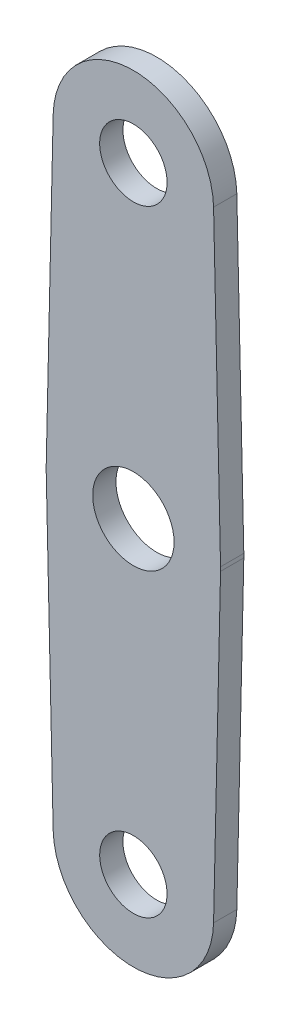
ISO-10303-21;
HEADER;
FILE_DESCRIPTION(('STEP AP214'),'2;1');
FILE_NAME('part.step','',(''),(''),'','','');
FILE_SCHEMA(('AUTOMOTIVE_DESIGN { 1 0 10303 214 1 1 1 1 }'));
ENDSEC;
DATA;
#1=APPLICATION_CONTEXT('core data for automotive mechanical design processes');
#2=APPLICATION_PROTOCOL_DEFINITION('international standard','automotive_design',2000,#1);
#3=PRODUCT_CONTEXT('',#1,'mechanical');
#4=PRODUCT('Part','Part','',(#3));
#5=PRODUCT_RELATED_PRODUCT_CATEGORY('part','',(#4));
#6=PRODUCT_DEFINITION_FORMATION('','',#4);
#7=PRODUCT_DEFINITION_CONTEXT('part definition',#1,'design');
#8=PRODUCT_DEFINITION('design','',#6,#7);
#9=PRODUCT_DEFINITION_SHAPE('','',#8);
#10=(LENGTH_UNIT() NAMED_UNIT(*) SI_UNIT(.MILLI.,.METRE.));
#11=(NAMED_UNIT(*) PLANE_ANGLE_UNIT() SI_UNIT($,.RADIAN.));
#12=(NAMED_UNIT(*) SI_UNIT($,.STERADIAN.) SOLID_ANGLE_UNIT());
#13=UNCERTAINTY_MEASURE_WITH_UNIT(LENGTH_MEASURE(1.E-05),#10,'distance_accuracy_value','');
#14=(GEOMETRIC_REPRESENTATION_CONTEXT(3) GLOBAL_UNCERTAINTY_ASSIGNED_CONTEXT((#13)) GLOBAL_UNIT_ASSIGNED_CONTEXT((#10,
#11,#12)) REPRESENTATION_CONTEXT('',''));
#15=CARTESIAN_POINT('',(0.,0.,0.));
#16=DIRECTION('',(0.,0.,1.));
#17=DIRECTION('',(1.,0.,0.));
#18=AXIS2_PLACEMENT_3D('',#15,#16,#17);
#19=CARTESIAN_POINT('',(0.,13.25,0.5));
#20=DIRECTION('',(0.,0.,1.));
#21=DIRECTION('',(1.,0.,0.));
#22=AXIS2_PLACEMENT_3D('',#19,#20,#21);
#23=PLANE('',#22);
#24=CARTESIAN_POINT('',(0.,13.25,0.5));
#25=DIRECTION('',(0.,0.,1.));
#26=DIRECTION('',(1.,0.,0.));
#27=AXIS2_PLACEMENT_3D('',#24,#25,#26);
#28=CIRCLE('',#27,1.45);
#29=CARTESIAN_POINT('',(1.45,13.25,0.5));
#30=VERTEX_POINT('',#29);
#31=EDGE_CURVE('E228',#30,#30,#28,.T.);
#32=ORIENTED_EDGE('',*,*,#31,.F.);
#33=EDGE_LOOP('',(#32));
#34=FACE_BOUND('',#33,.T.);
#35=CARTESIAN_POINT('',(0.,13.25,0.5));
#36=DIRECTION('',(0.,0.,1.));
#37=DIRECTION('',(1.,0.,0.));
#38=AXIS2_PLACEMENT_3D('',#35,#36,#37);
#39=CIRCLE('',#38,3.45);
#40=CARTESIAN_POINT('',(3.44911558617665,13.3281132075472,0.5));
#41=VERTEX_POINT('',#40);
#42=CARTESIAN_POINT('',(-3.44911558617665,13.3281132075472,0.5));
#43=VERTEX_POINT('',#42);
#44=EDGE_CURVE('E178',#41,#43,#39,.T.);
#45=ORIENTED_EDGE('',*,*,#44,.T.);
#46=DIRECTION('',(-0.0226415094339621,-0.999743648167145,0.));
#47=VECTOR('',#46,1.);
#48=CARTESIAN_POINT('',(-3.44911558617665,13.3281132075472,0.5));
#49=LINE('',#48,#47);
#50=CARTESIAN_POINT('',(-3.74903868062679,0.0849056603773579,0.5));
#51=VERTEX_POINT('',#50);
#52=EDGE_CURVE('E112',#43,#51,#49,.T.);
#53=ORIENTED_EDGE('',*,*,#52,.T.);
#54=CARTESIAN_POINT('',(0.,0.,0.5));
#55=DIRECTION('',(0.,0.,1.));
#56=DIRECTION('',(1.,0.,0.));
#57=AXIS2_PLACEMENT_3D('',#54,#55,#56);
#58=CIRCLE('',#57,3.75);
#59=CARTESIAN_POINT('',(-3.74903868062679,-0.0849056603773576,0.5));
#60=VERTEX_POINT('',#59);
#61=EDGE_CURVE('E199',#51,#60,#58,.T.);
#62=ORIENTED_EDGE('',*,*,#61,.T.);
#63=DIRECTION('',(0.0226415094339621,-0.999743648167145,0.));
#64=VECTOR('',#63,1.);
#65=CARTESIAN_POINT('',(-3.44911558617665,-13.3281132075472,0.5));
#66=LINE('',#65,#64);
#67=CARTESIAN_POINT('',(-3.44911558617665,-13.3281132075472,0.5));
#68=VERTEX_POINT('',#67);
#69=EDGE_CURVE('E213',#60,#68,#66,.T.);
#70=ORIENTED_EDGE('',*,*,#69,.T.);
#71=CARTESIAN_POINT('',(0.,-13.25,0.5));
#72=DIRECTION('',(0.,0.,1.));
#73=DIRECTION('',(-1.,0.,0.));
#74=AXIS2_PLACEMENT_3D('',#71,#72,#73);
#75=CIRCLE('',#74,3.45);
#76=CARTESIAN_POINT('',(3.44911558617665,-13.3281132075472,0.5));
#77=VERTEX_POINT('',#76);
#78=EDGE_CURVE('E131',#68,#77,#75,.T.);
#79=ORIENTED_EDGE('',*,*,#78,.T.);
#80=DIRECTION('',(0.0226415094339621,0.999743648167145,0.));
#81=VECTOR('',#80,1.);
#82=CARTESIAN_POINT('',(3.44911558617665,-13.3281132075472,0.5));
#83=LINE('',#82,#81);
#84=CARTESIAN_POINT('',(3.74903868062679,-0.0849056603773579,0.5));
#85=VERTEX_POINT('',#84);
#86=EDGE_CURVE('E125',#77,#85,#83,.T.);
#87=ORIENTED_EDGE('',*,*,#86,.T.);
#88=CARTESIAN_POINT('',(0.,0.,0.5));
#89=DIRECTION('',(0.,0.,1.));
#90=DIRECTION('',(1.,0.,0.));
#91=AXIS2_PLACEMENT_3D('',#88,#89,#90);
#92=CIRCLE('',#91,3.75);
#93=CARTESIAN_POINT('',(3.74903868062679,0.084905660377358,0.5));
#94=VERTEX_POINT('',#93);
#95=EDGE_CURVE('E129',#85,#94,#92,.T.);
#96=ORIENTED_EDGE('',*,*,#95,.T.);
#97=DIRECTION('',(-0.0226415094339621,0.999743648167145,0.));
#98=VECTOR('',#97,1.);
#99=CARTESIAN_POINT('',(3.44911558617665,13.3281132075472,0.5));
#100=LINE('',#99,#98);
#101=EDGE_CURVE('E69',#94,#41,#100,.T.);
#102=ORIENTED_EDGE('',*,*,#101,.T.);
#103=EDGE_LOOP('',(#45,#53,#62,#70,#79,#87,#96,#102));
#104=FACE_BOUND('',#103,.T.);
#105=CARTESIAN_POINT('',(0.,0.,0.5));
#106=DIRECTION('',(0.,0.,1.));
#107=DIRECTION('',(1.,0.,0.));
#108=AXIS2_PLACEMENT_3D('',#105,#106,#107);
#109=CIRCLE('',#108,1.75);
#110=CARTESIAN_POINT('',(1.75,0.,0.5));
#111=VERTEX_POINT('',#110);
#112=EDGE_CURVE('E160',#111,#111,#109,.T.);
#113=ORIENTED_EDGE('',*,*,#112,.F.);
#114=EDGE_LOOP('',(#113));
#115=FACE_BOUND('',#114,.T.);
#116=CARTESIAN_POINT('',(0.,-13.25,0.5));
#117=DIRECTION('',(0.,0.,1.));
#118=DIRECTION('',(-1.,0.,0.));
#119=AXIS2_PLACEMENT_3D('',#116,#117,#118);
#120=CIRCLE('',#119,1.45);
#121=CARTESIAN_POINT('',(-1.45,-13.25,0.5));
#122=VERTEX_POINT('',#121);
#123=EDGE_CURVE('E236',#122,#122,#120,.T.);
#124=ORIENTED_EDGE('',*,*,#123,.F.);
#125=EDGE_LOOP('',(#124));
#126=FACE_BOUND('',#125,.T.);
#127=ADVANCED_FACE('F51',(#34,#104,#115,#126),#23,.T.);
#128=CARTESIAN_POINT('',(0.,13.25,-0.5));
#129=DIRECTION('',(0.,0.,1.));
#130=DIRECTION('',(1.,0.,0.));
#131=AXIS2_PLACEMENT_3D('',#128,#129,#130);
#132=PLANE('',#131);
#133=CARTESIAN_POINT('',(0.,13.25,-0.5));
#134=DIRECTION('',(0.,0.,1.));
#135=DIRECTION('',(1.,0.,0.));
#136=AXIS2_PLACEMENT_3D('',#133,#134,#135);
#137=CIRCLE('',#136,3.45);
#138=CARTESIAN_POINT('',(3.44911558617665,13.3281132075472,-0.5));
#139=VERTEX_POINT('',#138);
#140=CARTESIAN_POINT('',(-3.44911558617665,13.3281132075472,-0.5));
#141=VERTEX_POINT('',#140);
#142=EDGE_CURVE('E155',#139,#141,#137,.T.);
#143=ORIENTED_EDGE('',*,*,#142,.F.);
#144=DIRECTION('',(-0.0226415094339621,0.999743648167145,0.));
#145=VECTOR('',#144,1.);
#146=CARTESIAN_POINT('',(3.44911558617665,13.3281132075472,-0.5));
#147=LINE('',#146,#145);
#148=CARTESIAN_POINT('',(3.74903868062679,0.084905660377358,-0.5));
#149=VERTEX_POINT('',#148);
#150=EDGE_CURVE('E104',#149,#139,#147,.T.);
#151=ORIENTED_EDGE('',*,*,#150,.F.);
#152=CARTESIAN_POINT('',(0.,0.,-0.5));
#153=DIRECTION('',(0.,0.,1.));
#154=DIRECTION('',(1.,0.,0.));
#155=AXIS2_PLACEMENT_3D('',#152,#153,#154);
#156=CIRCLE('',#155,3.75);
#157=CARTESIAN_POINT('',(3.74903868062679,-0.0849056603773579,-0.5));
#158=VERTEX_POINT('',#157);
#159=EDGE_CURVE('E98',#158,#149,#156,.T.);
#160=ORIENTED_EDGE('',*,*,#159,.F.);
#161=DIRECTION('',(0.0226415094339621,0.999743648167145,0.));
#162=VECTOR('',#161,1.);
#163=CARTESIAN_POINT('',(3.44911558617665,-13.3281132075472,-0.5));
#164=LINE('',#163,#162);
#165=CARTESIAN_POINT('',(3.44911558617665,-13.3281132075472,-0.5));
#166=VERTEX_POINT('',#165);
#167=EDGE_CURVE('E140',#166,#158,#164,.T.);
#168=ORIENTED_EDGE('',*,*,#167,.F.);
#169=CARTESIAN_POINT('',(0.,-13.25,-0.5));
#170=DIRECTION('',(0.,0.,1.));
#171=DIRECTION('',(-1.,0.,0.));
#172=AXIS2_PLACEMENT_3D('',#169,#170,#171);
#173=CIRCLE('',#172,3.45);
#174=CARTESIAN_POINT('',(-3.44911558617665,-13.3281132075472,-0.5));
#175=VERTEX_POINT('',#174);
#176=EDGE_CURVE('E169',#175,#166,#173,.T.);
#177=ORIENTED_EDGE('',*,*,#176,.F.);
#178=DIRECTION('',(0.0226415094339621,-0.999743648167145,0.));
#179=VECTOR('',#178,1.);
#180=CARTESIAN_POINT('',(-3.44911558617665,-13.3281132075472,-0.5));
#181=LINE('',#180,#179);
#182=CARTESIAN_POINT('',(-3.74903868062679,-0.0849056603773576,-0.5));
#183=VERTEX_POINT('',#182);
#184=EDGE_CURVE('E166',#183,#175,#181,.T.);
#185=ORIENTED_EDGE('',*,*,#184,.F.);
#186=CARTESIAN_POINT('',(0.,0.,-0.5));
#187=DIRECTION('',(0.,0.,1.));
#188=DIRECTION('',(1.,0.,0.));
#189=AXIS2_PLACEMENT_3D('',#186,#187,#188);
#190=CIRCLE('',#189,3.75);
#191=CARTESIAN_POINT('',(-3.74903868062679,0.0849056603773579,-0.5));
#192=VERTEX_POINT('',#191);
#193=EDGE_CURVE('E163',#192,#183,#190,.T.);
#194=ORIENTED_EDGE('',*,*,#193,.F.);
#195=DIRECTION('',(-0.0226415094339621,-0.999743648167145,0.));
#196=VECTOR('',#195,1.);
#197=CARTESIAN_POINT('',(-3.44911558617665,13.3281132075472,-0.5));
#198=LINE('',#197,#196);
#199=EDGE_CURVE('E159',#141,#192,#198,.T.);
#200=ORIENTED_EDGE('',*,*,#199,.F.);
#201=EDGE_LOOP('',(#143,#151,#160,#168,#177,#185,#194,#200));
#202=FACE_BOUND('',#201,.T.);
#203=CARTESIAN_POINT('',(0.,0.,-0.5));
#204=DIRECTION('',(0.,0.,1.));
#205=DIRECTION('',(1.,0.,0.));
#206=AXIS2_PLACEMENT_3D('',#203,#204,#205);
#207=CIRCLE('',#206,1.75);
#208=CARTESIAN_POINT('',(1.75,0.,-0.5));
#209=VERTEX_POINT('',#208);
#210=EDGE_CURVE('E224',#209,#209,#207,.T.);
#211=ORIENTED_EDGE('',*,*,#210,.T.);
#212=EDGE_LOOP('',(#211));
#213=FACE_BOUND('',#212,.T.);
#214=CARTESIAN_POINT('',(0.,13.25,-0.5));
#215=DIRECTION('',(0.,0.,1.));
#216=DIRECTION('',(1.,0.,0.));
#217=AXIS2_PLACEMENT_3D('',#214,#215,#216);
#218=CIRCLE('',#217,1.45);
#219=CARTESIAN_POINT('',(1.45,13.25,-0.5));
#220=VERTEX_POINT('',#219);
#221=EDGE_CURVE('E232',#220,#220,#218,.T.);
#222=ORIENTED_EDGE('',*,*,#221,.T.);
#223=EDGE_LOOP('',(#222));
#224=FACE_BOUND('',#223,.T.);
#225=CARTESIAN_POINT('',(0.,-13.25,-0.5));
#226=DIRECTION('',(0.,0.,1.));
#227=DIRECTION('',(-1.,0.,0.));
#228=AXIS2_PLACEMENT_3D('',#225,#226,#227);
#229=CIRCLE('',#228,1.45);
#230=CARTESIAN_POINT('',(-1.45,-13.25,-0.5));
#231=VERTEX_POINT('',#230);
#232=EDGE_CURVE('E240',#231,#231,#229,.T.);
#233=ORIENTED_EDGE('',*,*,#232,.T.);
#234=EDGE_LOOP('',(#233));
#235=FACE_BOUND('',#234,.T.);
#236=ADVANCED_FACE('F203',(#202,#213,#224,#235),#132,.F.);
#237=CARTESIAN_POINT('',(0.,13.25,0.5));
#238=DIRECTION('',(0.,0.,-1.));
#239=DIRECTION('',(-1.,0.,0.));
#240=AXIS2_PLACEMENT_3D('',#237,#238,#239);
#241=CYLINDRICAL_SURFACE('',#240,3.45);
#242=ORIENTED_EDGE('',*,*,#142,.T.);
#243=DIRECTION('',(0.,0.,-1.));
#244=VECTOR('',#243,1.);
#245=CARTESIAN_POINT('',(-3.44911558617665,13.3281132075472,0.5));
#246=LINE('',#245,#244);
#247=EDGE_CURVE('E11',#43,#141,#246,.T.);
#248=ORIENTED_EDGE('',*,*,#247,.F.);
#249=ORIENTED_EDGE('',*,*,#44,.F.);
#250=DIRECTION('',(0.,0.,-1.));
#251=VECTOR('',#250,1.);
#252=CARTESIAN_POINT('',(3.44911558617665,13.3281132075472,0.5));
#253=LINE('',#252,#251);
#254=EDGE_CURVE('E151',#41,#139,#253,.T.);
#255=ORIENTED_EDGE('',*,*,#254,.T.);
#256=EDGE_LOOP('',(#242,#248,#249,#255));
#257=FACE_BOUND('',#256,.T.);
#258=ADVANCED_FACE('F53',(#257),#241,.T.);
#259=CARTESIAN_POINT('',(-3.44911558617665,13.3281132075472,0.5));
#260=DIRECTION('',(0.999743648167145,-0.0226415094339621,0.));
#261=DIRECTION('',(0.0226415094339621,0.999743648167145,0.));
#262=AXIS2_PLACEMENT_3D('',#259,#260,#261);
#263=PLANE('',#262);
#264=ORIENTED_EDGE('',*,*,#199,.T.);
#265=DIRECTION('',(0.,0.,-1.));
#266=VECTOR('',#265,1.);
#267=CARTESIAN_POINT('',(-3.74903868062679,0.0849056603773579,0.5));
#268=LINE('',#267,#266);
#269=EDGE_CURVE('E61',#51,#192,#268,.T.);
#270=ORIENTED_EDGE('',*,*,#269,.F.);
#271=ORIENTED_EDGE('',*,*,#52,.F.);
#272=ORIENTED_EDGE('',*,*,#247,.T.);
#273=EDGE_LOOP('',(#264,#270,#271,#272));
#274=FACE_BOUND('',#273,.T.);
#275=ADVANCED_FACE('F276',(#274),#263,.F.);
#276=CARTESIAN_POINT('',(0.,0.,0.5));
#277=DIRECTION('',(0.,0.,-1.));
#278=DIRECTION('',(-1.,0.,0.));
#279=AXIS2_PLACEMENT_3D('',#276,#277,#278);
#280=CYLINDRICAL_SURFACE('',#279,3.75);
#281=ORIENTED_EDGE('',*,*,#193,.T.);
#282=DIRECTION('',(0.,0.,-1.));
#283=VECTOR('',#282,1.);
#284=CARTESIAN_POINT('',(-3.74903868062679,-0.0849056603773576,0.5));
#285=LINE('',#284,#283);
#286=EDGE_CURVE('E189',#60,#183,#285,.T.);
#287=ORIENTED_EDGE('',*,*,#286,.F.);
#288=ORIENTED_EDGE('',*,*,#61,.F.);
#289=ORIENTED_EDGE('',*,*,#269,.T.);
#290=EDGE_LOOP('',(#281,#287,#288,#289));
#291=FACE_BOUND('',#290,.T.);
#292=ADVANCED_FACE('F197',(#291),#280,.T.);
#293=CARTESIAN_POINT('',(-3.44911558617665,-13.3281132075472,0.5));
#294=DIRECTION('',(0.999743648167145,0.0226415094339621,0.));
#295=DIRECTION('',(-0.0226415094339621,0.999743648167145,0.));
#296=AXIS2_PLACEMENT_3D('',#293,#294,#295);
#297=PLANE('',#296);
#298=ORIENTED_EDGE('',*,*,#184,.T.);
#299=DIRECTION('',(0.,0.,-1.));
#300=VECTOR('',#299,1.);
#301=CARTESIAN_POINT('',(-3.44911558617665,-13.3281132075472,0.5));
#302=LINE('',#301,#300);
#303=EDGE_CURVE('E185',#68,#175,#302,.T.);
#304=ORIENTED_EDGE('',*,*,#303,.F.);
#305=ORIENTED_EDGE('',*,*,#69,.F.);
#306=ORIENTED_EDGE('',*,*,#286,.T.);
#307=EDGE_LOOP('',(#298,#304,#305,#306));
#308=FACE_BOUND('',#307,.T.);
#309=ADVANCED_FACE('F208',(#308),#297,.F.);
#310=CARTESIAN_POINT('',(0.,-13.25,0.5));
#311=DIRECTION('',(0.,0.,-1.));
#312=DIRECTION('',(-1.,0.,0.));
#313=AXIS2_PLACEMENT_3D('',#310,#311,#312);
#314=CYLINDRICAL_SURFACE('',#313,3.45);
#315=ORIENTED_EDGE('',*,*,#176,.T.);
#316=DIRECTION('',(0.,0.,-1.));
#317=VECTOR('',#316,1.);
#318=CARTESIAN_POINT('',(3.44911558617665,-13.3281132075472,0.5));
#319=LINE('',#318,#317);
#320=EDGE_CURVE('E142',#77,#166,#319,.T.);
#321=ORIENTED_EDGE('',*,*,#320,.F.);
#322=ORIENTED_EDGE('',*,*,#78,.F.);
#323=ORIENTED_EDGE('',*,*,#303,.T.);
#324=EDGE_LOOP('',(#315,#321,#322,#323));
#325=FACE_BOUND('',#324,.T.);
#326=ADVANCED_FACE('F211',(#325),#314,.T.);
#327=CARTESIAN_POINT('',(3.44911558617665,-13.3281132075472,0.5));
#328=DIRECTION('',(-0.999743648167145,0.0226415094339621,0.));
#329=DIRECTION('',(-0.0226415094339621,-0.999743648167145,0.));
#330=AXIS2_PLACEMENT_3D('',#327,#328,#329);
#331=PLANE('',#330);
#332=ORIENTED_EDGE('',*,*,#167,.T.);
#333=DIRECTION('',(0.,0.,-1.));
#334=VECTOR('',#333,1.);
#335=CARTESIAN_POINT('',(3.74903868062679,-0.0849056603773579,0.5));
#336=LINE('',#335,#334);
#337=EDGE_CURVE('E137',#85,#158,#336,.T.);
#338=ORIENTED_EDGE('',*,*,#337,.F.);
#339=ORIENTED_EDGE('',*,*,#86,.F.);
#340=ORIENTED_EDGE('',*,*,#320,.T.);
#341=EDGE_LOOP('',(#332,#338,#339,#340));
#342=FACE_BOUND('',#341,.T.);
#343=ADVANCED_FACE('F138',(#342),#331,.F.);
#344=CARTESIAN_POINT('',(0.,0.,0.5));
#345=DIRECTION('',(0.,0.,-1.));
#346=DIRECTION('',(-1.,0.,0.));
#347=AXIS2_PLACEMENT_3D('',#344,#345,#346);
#348=CYLINDRICAL_SURFACE('',#347,3.75);
#349=ORIENTED_EDGE('',*,*,#159,.T.);
#350=DIRECTION('',(0.,0.,-1.));
#351=VECTOR('',#350,1.);
#352=CARTESIAN_POINT('',(3.74903868062679,0.084905660377358,0.5));
#353=LINE('',#352,#351);
#354=EDGE_CURVE('E143',#94,#149,#353,.T.);
#355=ORIENTED_EDGE('',*,*,#354,.F.);
#356=ORIENTED_EDGE('',*,*,#95,.F.);
#357=ORIENTED_EDGE('',*,*,#337,.T.);
#358=EDGE_LOOP('',(#349,#355,#356,#357));
#359=FACE_BOUND('',#358,.T.);
#360=ADVANCED_FACE('F145',(#359),#348,.T.);
#361=CARTESIAN_POINT('',(3.44911558617665,13.3281132075472,0.5));
#362=DIRECTION('',(-0.999743648167145,-0.0226415094339621,0.));
#363=DIRECTION('',(0.0226415094339621,-0.999743648167145,0.));
#364=AXIS2_PLACEMENT_3D('',#361,#362,#363);
#365=PLANE('',#364);
#366=ORIENTED_EDGE('',*,*,#150,.T.);
#367=ORIENTED_EDGE('',*,*,#254,.F.);
#368=ORIENTED_EDGE('',*,*,#101,.F.);
#369=ORIENTED_EDGE('',*,*,#354,.T.);
#370=EDGE_LOOP('',(#366,#367,#368,#369));
#371=FACE_BOUND('',#370,.T.);
#372=ADVANCED_FACE('F264',(#371),#365,.F.);
#373=CARTESIAN_POINT('',(0.,0.,0.5));
#374=DIRECTION('',(0.,0.,-1.));
#375=DIRECTION('',(-1.,0.,0.));
#376=AXIS2_PLACEMENT_3D('',#373,#374,#375);
#377=CYLINDRICAL_SURFACE('',#376,1.75);
#378=ORIENTED_EDGE('',*,*,#112,.T.);
#379=EDGE_LOOP('',(#378));
#380=FACE_BOUND('',#379,.T.);
#381=ORIENTED_EDGE('',*,*,#210,.F.);
#382=EDGE_LOOP('',(#381));
#383=FACE_BOUND('',#382,.T.);
#384=ADVANCED_FACE('F261',(#380,#383),#377,.F.);
#385=CARTESIAN_POINT('',(0.,13.25,0.5));
#386=DIRECTION('',(0.,0.,-1.));
#387=DIRECTION('',(-1.,0.,0.));
#388=AXIS2_PLACEMENT_3D('',#385,#386,#387);
#389=CYLINDRICAL_SURFACE('',#388,1.45);
#390=ORIENTED_EDGE('',*,*,#31,.T.);
#391=EDGE_LOOP('',(#390));
#392=FACE_BOUND('',#391,.T.);
#393=ORIENTED_EDGE('',*,*,#221,.F.);
#394=EDGE_LOOP('',(#393));
#395=FACE_BOUND('',#394,.T.);
#396=ADVANCED_FACE('F371',(#392,#395),#389,.F.);
#397=CARTESIAN_POINT('',(0.,-13.25,0.5));
#398=DIRECTION('',(0.,0.,-1.));
#399=DIRECTION('',(-1.,0.,0.));
#400=AXIS2_PLACEMENT_3D('',#397,#398,#399);
#401=CYLINDRICAL_SURFACE('',#400,1.45);
#402=ORIENTED_EDGE('',*,*,#123,.T.);
#403=EDGE_LOOP('',(#402));
#404=FACE_BOUND('',#403,.T.);
#405=ORIENTED_EDGE('',*,*,#232,.F.);
#406=EDGE_LOOP('',(#405));
#407=FACE_BOUND('',#406,.T.);
#408=ADVANCED_FACE('F249',(#404,#407),#401,.F.);
#409=CLOSED_SHELL('',(#127,#236,#258,#275,#292,#309,#326,#343,#360,#372,#384,#396,#408));
#410=MANIFOLD_SOLID_BREP('B2',#409);
#411=ADVANCED_BREP_SHAPE_REPRESENTATION('',(#18,#410),#14);
#412=SHAPE_DEFINITION_REPRESENTATION(#9,#411);
ENDSEC;
END-ISO-10303-21;
